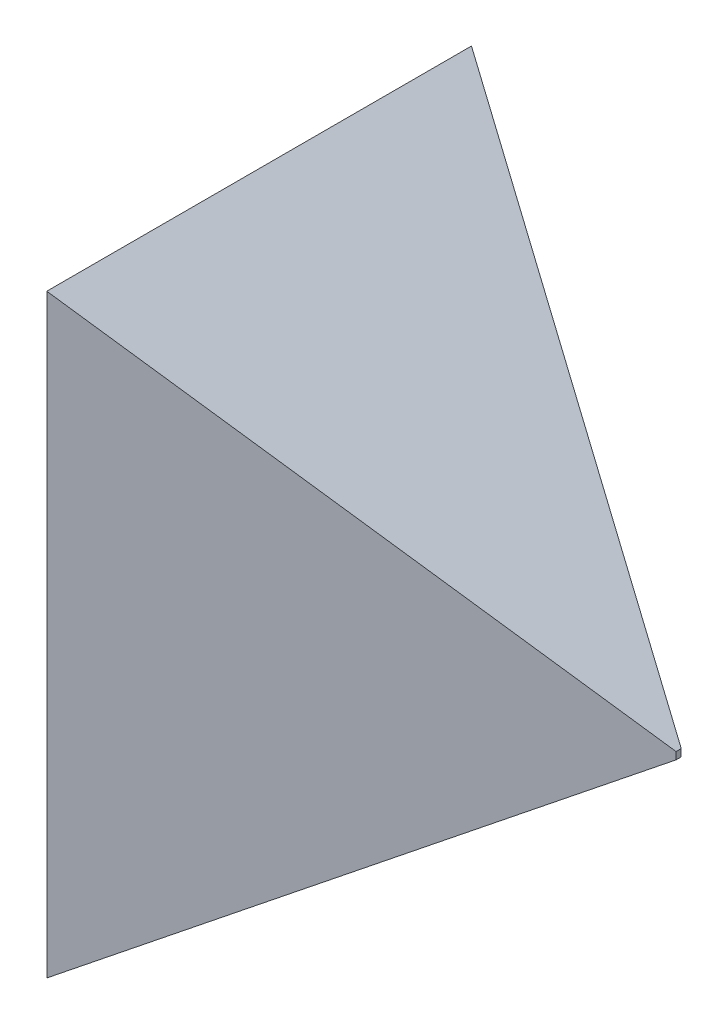
ISO-10303-21;
HEADER;
FILE_DESCRIPTION(('STEP AP214'),'2;1');
FILE_NAME('part.step','',(''),(''),'','','');
FILE_SCHEMA(('AUTOMOTIVE_DESIGN { 1 0 10303 214 1 1 1 1 }'));
ENDSEC;
DATA;
#1=APPLICATION_CONTEXT('core data for automotive mechanical design processes');
#2=APPLICATION_PROTOCOL_DEFINITION('international standard','automotive_design',2000,#1);
#3=PRODUCT_CONTEXT('',#1,'mechanical');
#4=PRODUCT('Part','Part','',(#3));
#5=PRODUCT_RELATED_PRODUCT_CATEGORY('part','',(#4));
#6=PRODUCT_DEFINITION_FORMATION('','',#4);
#7=PRODUCT_DEFINITION_CONTEXT('part definition',#1,'design');
#8=PRODUCT_DEFINITION('design','',#6,#7);
#9=PRODUCT_DEFINITION_SHAPE('','',#8);
#10=(LENGTH_UNIT() NAMED_UNIT(*) SI_UNIT(.MILLI.,.METRE.));
#11=(NAMED_UNIT(*) PLANE_ANGLE_UNIT() SI_UNIT($,.RADIAN.));
#12=(NAMED_UNIT(*) SI_UNIT($,.STERADIAN.) SOLID_ANGLE_UNIT());
#13=UNCERTAINTY_MEASURE_WITH_UNIT(LENGTH_MEASURE(1.E-05),#10,'distance_accuracy_value','');
#14=(GEOMETRIC_REPRESENTATION_CONTEXT(3) GLOBAL_UNCERTAINTY_ASSIGNED_CONTEXT((#13)) GLOBAL_UNIT_ASSIGNED_CONTEXT((#10,
#11,#12)) REPRESENTATION_CONTEXT('',''));
#15=CARTESIAN_POINT('',(0.,0.,0.));
#16=DIRECTION('',(0.,0.,1.));
#17=DIRECTION('',(1.,0.,0.));
#18=AXIS2_PLACEMENT_3D('',#15,#16,#17);
#19=CARTESIAN_POINT('',(0.,0.,20000.));
#20=DIRECTION('',(-0.573576436351048,0.819152044288991,0.));
#21=DIRECTION('',(-0.819152044288991,-0.573576436351048,0.));
#22=AXIS2_PLACEMENT_3D('',#19,#20,#21);
#23=PLANE('',#22);
#24=DIRECTION('',(0.758034746711795,0.530781643872489,0.379017373355897));
#25=VECTOR('',#24,1.);
#26=CARTESIAN_POINT('',(2873.08338611207,2011.75464486076,11436.541693056));
#27=LINE('',#26,#25);
#28=CARTESIAN_POINT('',(-16383.0408857798,-11471.528727021,1808.47955711009));
#29=VERTEX_POINT('',#28);
#30=CARTESIAN_POINT('',(-199.999999999999,-140.041507641942,9900.));
#31=VERTEX_POINT('',#30);
#32=EDGE_CURVE('E87',#29,#31,#27,.T.);
#33=ORIENTED_EDGE('',*,*,#32,.T.);
#34=DIRECTION('',(0.,0.,1.));
#35=VECTOR('',#34,1.);
#36=CARTESIAN_POINT('',(-199.999999999998,-140.041507641941,20000.));
#37=LINE('',#36,#35);
#38=CARTESIAN_POINT('',(-199.999999999998,-140.041507641943,10100.));
#39=VERTEX_POINT('',#38);
#40=EDGE_CURVE('E47',#31,#39,#37,.T.);
#41=ORIENTED_EDGE('',*,*,#40,.T.);
#42=DIRECTION('',(-0.758034746711795,-0.530781643872489,0.379017373355897));
#43=VECTOR('',#42,1.);
#44=CARTESIAN_POINT('',(-2873.08338611207,-2011.75464486076,11436.541693056));
#45=LINE('',#44,#43);
#46=CARTESIAN_POINT('',(-16383.0408857798,-11471.528727021,18191.5204428899));
#47=VERTEX_POINT('',#46);
#48=EDGE_CURVE('E86',#39,#47,#45,.T.);
#49=ORIENTED_EDGE('',*,*,#48,.T.);
#50=DIRECTION('',(0.,0.,-1.));
#51=VECTOR('',#50,1.);
#52=CARTESIAN_POINT('',(-16383.0408857798,-11471.528727021,20000.));
#53=LINE('',#52,#51);
#54=EDGE_CURVE('E73',#47,#29,#53,.T.);
#55=ORIENTED_EDGE('',*,*,#54,.T.);
#56=EDGE_LOOP('',(#33,#41,#49,#55));
#57=FACE_BOUND('',#56,.T.);
#58=ADVANCED_FACE('F33',(#57),#23,.F.);
#59=CARTESIAN_POINT('',(0.,0.,20000.));
#60=DIRECTION('',(-0.573576436351047,-0.819152044288991,0.));
#61=DIRECTION('',(0.819152044288991,-0.573576436351047,0.));
#62=AXIS2_PLACEMENT_3D('',#59,#60,#61);
#63=PLANE('',#62);
#64=DIRECTION('',(0.758034746711795,-0.530781643872488,-0.379017373355898));
#65=VECTOR('',#64,1.);
#66=CARTESIAN_POINT('',(-2873.08338611208,2011.75464486076,11436.541693056));
#67=LINE('',#66,#65);
#68=CARTESIAN_POINT('',(-16383.0408857798,11471.5287270209,18191.5204428899));
#69=VERTEX_POINT('',#68);
#70=CARTESIAN_POINT('',(-199.999999999998,140.041507641943,10100.));
#71=VERTEX_POINT('',#70);
#72=EDGE_CURVE('E81',#69,#71,#67,.T.);
#73=ORIENTED_EDGE('',*,*,#72,.T.);
#74=DIRECTION('',(0.,0.,-1.));
#75=VECTOR('',#74,1.);
#76=CARTESIAN_POINT('',(-199.999999999998,140.041507641941,20000.));
#77=LINE('',#76,#75);
#78=CARTESIAN_POINT('',(-199.999999999998,140.041507641941,9900.));
#79=VERTEX_POINT('',#78);
#80=EDGE_CURVE('E100',#71,#79,#77,.T.);
#81=ORIENTED_EDGE('',*,*,#80,.T.);
#82=DIRECTION('',(-0.758034746711795,0.530781643872488,-0.379017373355898));
#83=VECTOR('',#82,1.);
#84=CARTESIAN_POINT('',(2873.08338611208,-2011.75464486076,11436.541693056));
#85=LINE('',#84,#83);
#86=CARTESIAN_POINT('',(-16383.0408857798,11471.5287270209,1808.47955711009));
#87=VERTEX_POINT('',#86);
#88=EDGE_CURVE('E92',#79,#87,#85,.T.);
#89=ORIENTED_EDGE('',*,*,#88,.T.);
#90=DIRECTION('',(0.,0.,-1.));
#91=VECTOR('',#90,1.);
#92=CARTESIAN_POINT('',(-16383.0408857798,11471.5287270209,20000.));
#93=LINE('',#92,#91);
#94=EDGE_CURVE('E40',#69,#87,#93,.T.);
#95=ORIENTED_EDGE('',*,*,#94,.F.);
#96=EDGE_LOOP('',(#73,#81,#89,#95));
#97=FACE_BOUND('',#96,.T.);
#98=ADVANCED_FACE('F90',(#97),#63,.F.);
#99=CARTESIAN_POINT('',(0.,-11471.528727021,10000.));
#100=DIRECTION('',(-0.447213595499958,0.,-0.894427190999916));
#101=DIRECTION('',(-0.894427190999916,0.,0.447213595499958));
#102=AXIS2_PLACEMENT_3D('',#99,#100,#101);
#103=PLANE('',#102);
#104=ORIENTED_EDGE('',*,*,#72,.F.);
#105=DIRECTION('',(0.,1.,0.));
#106=VECTOR('',#105,1.);
#107=CARTESIAN_POINT('',(-16383.0408857798,-11471.528727021,18191.5204428899));
#108=LINE('',#107,#106);
#109=EDGE_CURVE('E69',#47,#69,#108,.T.);
#110=ORIENTED_EDGE('',*,*,#109,.F.);
#111=ORIENTED_EDGE('',*,*,#48,.F.);
#112=DIRECTION('',(0.,1.,0.));
#113=VECTOR('',#112,1.);
#114=CARTESIAN_POINT('',(-199.999999999998,-11471.528727021,10100.));
#115=LINE('',#114,#113);
#116=EDGE_CURVE('E83',#39,#71,#115,.T.);
#117=ORIENTED_EDGE('',*,*,#116,.T.);
#118=EDGE_LOOP('',(#104,#110,#111,#117));
#119=FACE_BOUND('',#118,.T.);
#120=ADVANCED_FACE('F82',(#119),#103,.F.);
#121=CARTESIAN_POINT('',(1.55431223447522E-12,-11471.528727021,10000.));
#122=DIRECTION('',(-0.447213595499958,0.,0.894427190999916));
#123=DIRECTION('',(0.894427190999916,0.,0.447213595499958));
#124=AXIS2_PLACEMENT_3D('',#121,#122,#123);
#125=PLANE('',#124);
#126=ORIENTED_EDGE('',*,*,#32,.F.);
#127=DIRECTION('',(0.,1.,0.));
#128=VECTOR('',#127,1.);
#129=CARTESIAN_POINT('',(-16383.0408857798,-11471.528727021,1808.47955711009));
#130=LINE('',#129,#128);
#131=EDGE_CURVE('E77',#29,#87,#130,.T.);
#132=ORIENTED_EDGE('',*,*,#131,.T.);
#133=ORIENTED_EDGE('',*,*,#88,.F.);
#134=DIRECTION('',(0.,-1.,0.));
#135=VECTOR('',#134,1.);
#136=CARTESIAN_POINT('',(-199.999999999998,-11471.528727021,9900.));
#137=LINE('',#136,#135);
#138=EDGE_CURVE('E11',#79,#31,#137,.T.);
#139=ORIENTED_EDGE('',*,*,#138,.T.);
#140=EDGE_LOOP('',(#126,#132,#133,#139));
#141=FACE_BOUND('',#140,.T.);
#142=ADVANCED_FACE('F105',(#141),#125,.F.);
#143=CARTESIAN_POINT('',(-199.999999999998,-11471.528727021,10100.));
#144=DIRECTION('',(-1.,0.,0.));
#145=DIRECTION('',(0.,0.,1.));
#146=AXIS2_PLACEMENT_3D('',#143,#144,#145);
#147=PLANE('',#146);
#148=ORIENTED_EDGE('',*,*,#138,.F.);
#149=ORIENTED_EDGE('',*,*,#80,.F.);
#150=ORIENTED_EDGE('',*,*,#116,.F.);
#151=ORIENTED_EDGE('',*,*,#40,.F.);
#152=EDGE_LOOP('',(#148,#149,#150,#151));
#153=FACE_BOUND('',#152,.T.);
#154=ADVANCED_FACE('F118',(#153),#147,.F.);
#155=CARTESIAN_POINT('',(-16383.0408857798,-11471.528727021,18191.5204428899));
#156=DIRECTION('',(1.,0.,0.));
#157=DIRECTION('',(0.,0.,-1.));
#158=AXIS2_PLACEMENT_3D('',#155,#156,#157);
#159=PLANE('',#158);
#160=ORIENTED_EDGE('',*,*,#131,.F.);
#161=ORIENTED_EDGE('',*,*,#54,.F.);
#162=ORIENTED_EDGE('',*,*,#109,.T.);
#163=ORIENTED_EDGE('',*,*,#94,.T.);
#164=EDGE_LOOP('',(#160,#161,#162,#163));
#165=FACE_BOUND('',#164,.T.);
#166=ADVANCED_FACE('F71',(#165),#159,.F.);
#167=CLOSED_SHELL('',(#58,#98,#120,#142,#154,#166));
#168=MANIFOLD_SOLID_BREP('B2',#167);
#169=ADVANCED_BREP_SHAPE_REPRESENTATION('',(#18,#168),#14);
#170=SHAPE_DEFINITION_REPRESENTATION(#9,#169);
ENDSEC;
END-ISO-10303-21;
